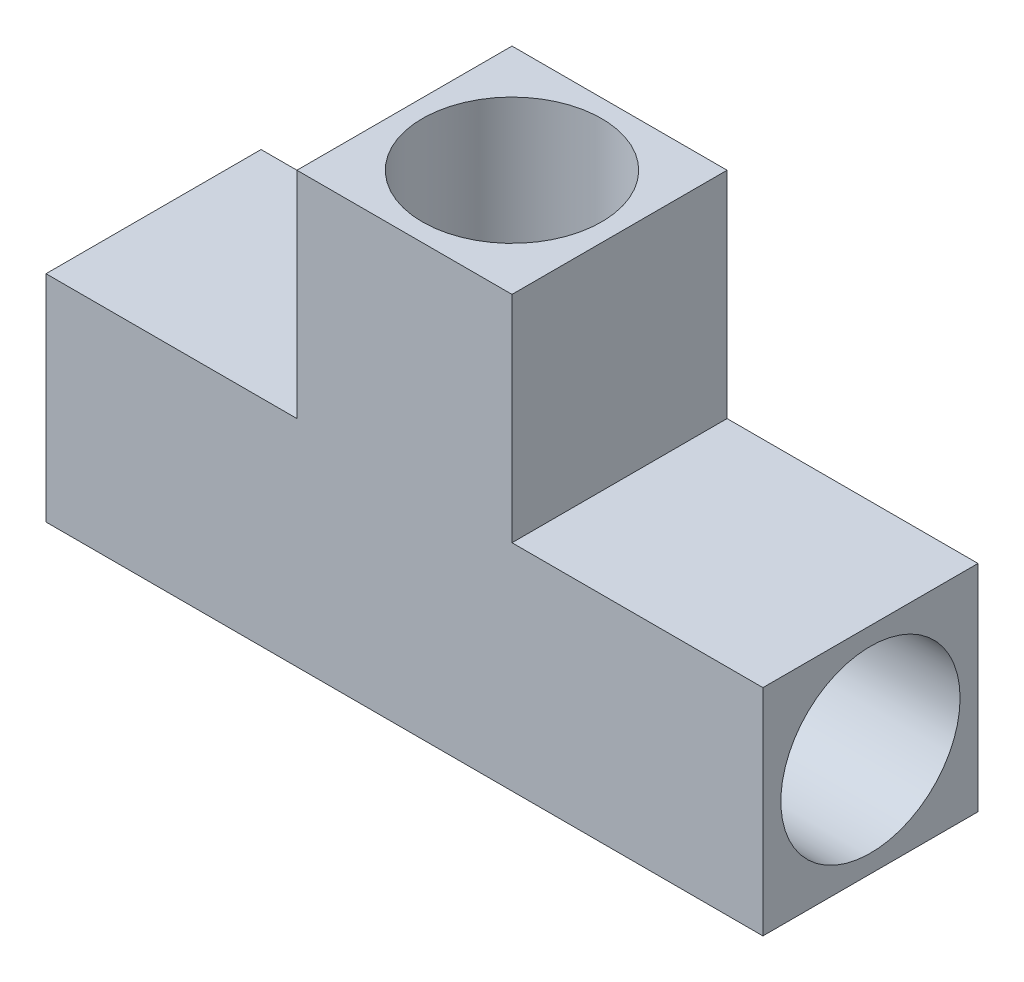
ISO-10303-21;
HEADER;
FILE_DESCRIPTION(('STEP AP214'),'2;1');
FILE_NAME('part.step','',(''),(''),'','','');
FILE_SCHEMA(('AUTOMOTIVE_DESIGN { 1 0 10303 214 1 1 1 1 }'));
ENDSEC;
DATA;
#1=APPLICATION_CONTEXT('core data for automotive mechanical design processes');
#2=APPLICATION_PROTOCOL_DEFINITION('international standard','automotive_design',2000,#1);
#3=PRODUCT_CONTEXT('',#1,'mechanical');
#4=PRODUCT('Part','Part','',(#3));
#5=PRODUCT_RELATED_PRODUCT_CATEGORY('part','',(#4));
#6=PRODUCT_DEFINITION_FORMATION('','',#4);
#7=PRODUCT_DEFINITION_CONTEXT('part definition',#1,'design');
#8=PRODUCT_DEFINITION('design','',#6,#7);
#9=PRODUCT_DEFINITION_SHAPE('','',#8);
#10=(LENGTH_UNIT() NAMED_UNIT(*) SI_UNIT(.MILLI.,.METRE.));
#11=(NAMED_UNIT(*) PLANE_ANGLE_UNIT() SI_UNIT($,.RADIAN.));
#12=(NAMED_UNIT(*) SI_UNIT($,.STERADIAN.) SOLID_ANGLE_UNIT());
#13=UNCERTAINTY_MEASURE_WITH_UNIT(LENGTH_MEASURE(1.E-05),#10,'distance_accuracy_value','');
#14=(GEOMETRIC_REPRESENTATION_CONTEXT(3) GLOBAL_UNCERTAINTY_ASSIGNED_CONTEXT((#13)) GLOBAL_UNIT_ASSIGNED_CONTEXT((#10,
#11,#12)) REPRESENTATION_CONTEXT('',''));
#15=CARTESIAN_POINT('',(0.,0.,0.));
#16=DIRECTION('',(0.,0.,1.));
#17=DIRECTION('',(1.,0.,0.));
#18=AXIS2_PLACEMENT_3D('',#15,#16,#17);
#19=CARTESIAN_POINT('',(50.,15.,15.));
#20=DIRECTION('',(-1.,0.,0.));
#21=DIRECTION('',(0.,0.,1.));
#22=AXIS2_PLACEMENT_3D('',#19,#20,#21);
#23=PLANE('',#22);
#24=CARTESIAN_POINT('',(50.,0.,0.));
#25=DIRECTION('',(1.,0.,0.));
#26=DIRECTION('',(0.,0.,-1.));
#27=AXIS2_PLACEMENT_3D('',#24,#25,#26);
#28=CIRCLE('',#27,12.5);
#29=CARTESIAN_POINT('',(50.,0.,-12.5));
#30=VERTEX_POINT('',#29);
#31=EDGE_CURVE('E192',#30,#30,#28,.T.);
#32=ORIENTED_EDGE('',*,*,#31,.F.);
#33=EDGE_LOOP('',(#32));
#34=FACE_BOUND('',#33,.T.);
#35=DIRECTION('',(0.,1.,0.));
#36=VECTOR('',#35,1.);
#37=CARTESIAN_POINT('',(50.,15.,-15.));
#38=LINE('',#37,#36);
#39=CARTESIAN_POINT('',(50.,-15.,-15.));
#40=VERTEX_POINT('',#39);
#41=CARTESIAN_POINT('',(50.,15.,-15.));
#42=VERTEX_POINT('',#41);
#43=EDGE_CURVE('E139',#40,#42,#38,.T.);
#44=ORIENTED_EDGE('',*,*,#43,.T.);
#45=DIRECTION('',(0.,0.,-1.));
#46=VECTOR('',#45,1.);
#47=CARTESIAN_POINT('',(50.,15.,15.));
#48=LINE('',#47,#46);
#49=CARTESIAN_POINT('',(50.,15.,15.));
#50=VERTEX_POINT('',#49);
#51=EDGE_CURVE('E168',#50,#42,#48,.T.);
#52=ORIENTED_EDGE('',*,*,#51,.F.);
#53=DIRECTION('',(0.,1.,0.));
#54=VECTOR('',#53,1.);
#55=CARTESIAN_POINT('',(50.,15.,15.));
#56=LINE('',#55,#54);
#57=CARTESIAN_POINT('',(50.,-15.,15.));
#58=VERTEX_POINT('',#57);
#59=EDGE_CURVE('E155',#58,#50,#56,.T.);
#60=ORIENTED_EDGE('',*,*,#59,.F.);
#61=DIRECTION('',(0.,0.,-1.));
#62=VECTOR('',#61,1.);
#63=CARTESIAN_POINT('',(50.,-15.,15.));
#64=LINE('',#63,#62);
#65=EDGE_CURVE('E135',#58,#40,#64,.T.);
#66=ORIENTED_EDGE('',*,*,#65,.T.);
#67=EDGE_LOOP('',(#44,#52,#60,#66));
#68=FACE_BOUND('',#67,.T.);
#69=ADVANCED_FACE('F35',(#34,#68),#23,.F.);
#70=CARTESIAN_POINT('',(15.,15.,15.));
#71=DIRECTION('',(0.,-1.,0.));
#72=DIRECTION('',(1.,0.,0.));
#73=AXIS2_PLACEMENT_3D('',#70,#71,#72);
#74=PLANE('',#73);
#75=DIRECTION('',(-1.,0.,0.));
#76=VECTOR('',#75,1.);
#77=CARTESIAN_POINT('',(15.,15.,-15.));
#78=LINE('',#77,#76);
#79=CARTESIAN_POINT('',(15.,15.,-15.));
#80=VERTEX_POINT('',#79);
#81=EDGE_CURVE('E142',#42,#80,#78,.T.);
#82=ORIENTED_EDGE('',*,*,#81,.T.);
#83=DIRECTION('',(0.,0.,-1.));
#84=VECTOR('',#83,1.);
#85=CARTESIAN_POINT('',(15.,15.,15.));
#86=LINE('',#85,#84);
#87=CARTESIAN_POINT('',(15.,15.,15.));
#88=VERTEX_POINT('',#87);
#89=EDGE_CURVE('E165',#88,#80,#86,.T.);
#90=ORIENTED_EDGE('',*,*,#89,.F.);
#91=DIRECTION('',(-1.,0.,0.));
#92=VECTOR('',#91,1.);
#93=CARTESIAN_POINT('',(15.,15.,15.));
#94=LINE('',#93,#92);
#95=EDGE_CURVE('E97',#50,#88,#94,.T.);
#96=ORIENTED_EDGE('',*,*,#95,.F.);
#97=ORIENTED_EDGE('',*,*,#51,.T.);
#98=EDGE_LOOP('',(#82,#90,#96,#97));
#99=FACE_BOUND('',#98,.T.);
#100=ADVANCED_FACE('F183',(#99),#74,.F.);
#101=CARTESIAN_POINT('',(15.,45.,15.));
#102=DIRECTION('',(-1.,0.,0.));
#103=DIRECTION('',(0.,0.,1.));
#104=AXIS2_PLACEMENT_3D('',#101,#102,#103);
#105=PLANE('',#104);
#106=DIRECTION('',(0.,1.,0.));
#107=VECTOR('',#106,1.);
#108=CARTESIAN_POINT('',(15.,45.,-15.));
#109=LINE('',#108,#107);
#110=CARTESIAN_POINT('',(15.,45.,-15.));
#111=VERTEX_POINT('',#110);
#112=EDGE_CURVE('E145',#80,#111,#109,.T.);
#113=ORIENTED_EDGE('',*,*,#112,.T.);
#114=DIRECTION('',(0.,0.,-1.));
#115=VECTOR('',#114,1.);
#116=CARTESIAN_POINT('',(15.,45.,15.));
#117=LINE('',#116,#115);
#118=CARTESIAN_POINT('',(15.,45.,15.));
#119=VERTEX_POINT('',#118);
#120=EDGE_CURVE('E162',#119,#111,#117,.T.);
#121=ORIENTED_EDGE('',*,*,#120,.F.);
#122=DIRECTION('',(0.,1.,0.));
#123=VECTOR('',#122,1.);
#124=CARTESIAN_POINT('',(15.,45.,15.));
#125=LINE('',#124,#123);
#126=EDGE_CURVE('E202',#88,#119,#125,.T.);
#127=ORIENTED_EDGE('',*,*,#126,.F.);
#128=ORIENTED_EDGE('',*,*,#89,.T.);
#129=EDGE_LOOP('',(#113,#121,#127,#128));
#130=FACE_BOUND('',#129,.T.);
#131=ADVANCED_FACE('F188',(#130),#105,.F.);
#132=CARTESIAN_POINT('',(-15.,45.,15.));
#133=DIRECTION('',(0.,-1.,0.));
#134=DIRECTION('',(0.,0.,-1.));
#135=AXIS2_PLACEMENT_3D('',#132,#133,#134);
#136=PLANE('',#135);
#137=CARTESIAN_POINT('',(0.,45.,0.));
#138=DIRECTION('',(0.,1.,0.));
#139=DIRECTION('',(0.,0.,1.));
#140=AXIS2_PLACEMENT_3D('',#137,#138,#139);
#141=CIRCLE('',#140,12.5);
#142=CARTESIAN_POINT('',(0.,45.,12.5));
#143=VERTEX_POINT('',#142);
#144=EDGE_CURVE('E211',#143,#143,#141,.T.);
#145=ORIENTED_EDGE('',*,*,#144,.F.);
#146=EDGE_LOOP('',(#145));
#147=FACE_BOUND('',#146,.T.);
#148=DIRECTION('',(-1.,0.,0.));
#149=VECTOR('',#148,1.);
#150=CARTESIAN_POINT('',(-15.,45.,-15.));
#151=LINE('',#150,#149);
#152=CARTESIAN_POINT('',(-15.,45.,-15.));
#153=VERTEX_POINT('',#152);
#154=EDGE_CURVE('E147',#111,#153,#151,.T.);
#155=ORIENTED_EDGE('',*,*,#154,.T.);
#156=DIRECTION('',(0.,0.,-1.));
#157=VECTOR('',#156,1.);
#158=CARTESIAN_POINT('',(-15.,45.,15.));
#159=LINE('',#158,#157);
#160=CARTESIAN_POINT('',(-15.,45.,15.));
#161=VERTEX_POINT('',#160);
#162=EDGE_CURVE('E159',#161,#153,#159,.T.);
#163=ORIENTED_EDGE('',*,*,#162,.F.);
#164=DIRECTION('',(-1.,0.,0.));
#165=VECTOR('',#164,1.);
#166=CARTESIAN_POINT('',(-15.,45.,15.));
#167=LINE('',#166,#165);
#168=EDGE_CURVE('E204',#119,#161,#167,.T.);
#169=ORIENTED_EDGE('',*,*,#168,.F.);
#170=ORIENTED_EDGE('',*,*,#120,.T.);
#171=EDGE_LOOP('',(#155,#163,#169,#170));
#172=FACE_BOUND('',#171,.T.);
#173=ADVANCED_FACE('F216',(#147,#172),#136,.F.);
#174=CARTESIAN_POINT('',(-15.,45.,15.));
#175=DIRECTION('',(1.,0.,0.));
#176=DIRECTION('',(0.,1.,0.));
#177=AXIS2_PLACEMENT_3D('',#174,#175,#176);
#178=PLANE('',#177);
#179=DIRECTION('',(0.,-1.,0.));
#180=VECTOR('',#179,1.);
#181=CARTESIAN_POINT('',(-15.,45.,-15.));
#182=LINE('',#181,#180);
#183=CARTESIAN_POINT('',(-15.,15.,-15.));
#184=VERTEX_POINT('',#183);
#185=EDGE_CURVE('E149',#153,#184,#182,.T.);
#186=ORIENTED_EDGE('',*,*,#185,.T.);
#187=DIRECTION('',(0.,0.,-1.));
#188=VECTOR('',#187,1.);
#189=CARTESIAN_POINT('',(-15.,15.,15.));
#190=LINE('',#189,#188);
#191=CARTESIAN_POINT('',(-15.,15.,15.));
#192=VERTEX_POINT('',#191);
#193=EDGE_CURVE('E130',#192,#184,#190,.T.);
#194=ORIENTED_EDGE('',*,*,#193,.F.);
#195=DIRECTION('',(0.,-1.,0.));
#196=VECTOR('',#195,1.);
#197=CARTESIAN_POINT('',(-15.,45.,15.));
#198=LINE('',#197,#196);
#199=EDGE_CURVE('E118',#161,#192,#198,.T.);
#200=ORIENTED_EDGE('',*,*,#199,.F.);
#201=ORIENTED_EDGE('',*,*,#162,.T.);
#202=EDGE_LOOP('',(#186,#194,#200,#201));
#203=FACE_BOUND('',#202,.T.);
#204=ADVANCED_FACE('F219',(#203),#178,.F.);
#205=CARTESIAN_POINT('',(-50.,15.,15.));
#206=DIRECTION('',(0.,-1.,0.));
#207=DIRECTION('',(1.,0.,0.));
#208=AXIS2_PLACEMENT_3D('',#205,#206,#207);
#209=PLANE('',#208);
#210=DIRECTION('',(-1.,0.,0.));
#211=VECTOR('',#210,1.);
#212=CARTESIAN_POINT('',(-50.,15.,-15.));
#213=LINE('',#212,#211);
#214=CARTESIAN_POINT('',(-50.,15.,-15.));
#215=VERTEX_POINT('',#214);
#216=EDGE_CURVE('E127',#184,#215,#213,.T.);
#217=ORIENTED_EDGE('',*,*,#216,.T.);
#218=DIRECTION('',(0.,0.,-1.));
#219=VECTOR('',#218,1.);
#220=CARTESIAN_POINT('',(-50.,15.,15.));
#221=LINE('',#220,#219);
#222=CARTESIAN_POINT('',(-50.,15.,15.));
#223=VERTEX_POINT('',#222);
#224=EDGE_CURVE('E124',#223,#215,#221,.T.);
#225=ORIENTED_EDGE('',*,*,#224,.F.);
#226=DIRECTION('',(-1.,0.,0.));
#227=VECTOR('',#226,1.);
#228=CARTESIAN_POINT('',(-50.,15.,15.));
#229=LINE('',#228,#227);
#230=EDGE_CURVE('E111',#192,#223,#229,.T.);
#231=ORIENTED_EDGE('',*,*,#230,.F.);
#232=ORIENTED_EDGE('',*,*,#193,.T.);
#233=EDGE_LOOP('',(#217,#225,#231,#232));
#234=FACE_BOUND('',#233,.T.);
#235=ADVANCED_FACE('F125',(#234),#209,.F.);
#236=CARTESIAN_POINT('',(-50.,15.,15.));
#237=DIRECTION('',(1.,0.,0.));
#238=DIRECTION('',(0.,0.,-1.));
#239=AXIS2_PLACEMENT_3D('',#236,#237,#238);
#240=PLANE('',#239);
#241=CARTESIAN_POINT('',(-50.,0.,0.));
#242=DIRECTION('',(1.,0.,0.));
#243=DIRECTION('',(0.,0.,-1.));
#244=AXIS2_PLACEMENT_3D('',#241,#242,#243);
#245=CIRCLE('',#244,12.5);
#246=CARTESIAN_POINT('',(-50.,0.,-12.5));
#247=VERTEX_POINT('',#246);
#248=EDGE_CURVE('E143',#247,#247,#245,.T.);
#249=ORIENTED_EDGE('',*,*,#248,.T.);
#250=EDGE_LOOP('',(#249));
#251=FACE_BOUND('',#250,.T.);
#252=DIRECTION('',(0.,-1.,0.));
#253=VECTOR('',#252,1.);
#254=CARTESIAN_POINT('',(-50.,15.,-15.));
#255=LINE('',#254,#253);
#256=CARTESIAN_POINT('',(-50.,-15.,-15.));
#257=VERTEX_POINT('',#256);
#258=EDGE_CURVE('E152',#215,#257,#255,.T.);
#259=ORIENTED_EDGE('',*,*,#258,.T.);
#260=DIRECTION('',(0.,0.,-1.));
#261=VECTOR('',#260,1.);
#262=CARTESIAN_POINT('',(-50.,-15.,15.));
#263=LINE('',#262,#261);
#264=CARTESIAN_POINT('',(-50.,-15.,15.));
#265=VERTEX_POINT('',#264);
#266=EDGE_CURVE('E131',#265,#257,#263,.T.);
#267=ORIENTED_EDGE('',*,*,#266,.F.);
#268=DIRECTION('',(0.,-1.,0.));
#269=VECTOR('',#268,1.);
#270=CARTESIAN_POINT('',(-50.,15.,15.));
#271=LINE('',#270,#269);
#272=EDGE_CURVE('E115',#223,#265,#271,.T.);
#273=ORIENTED_EDGE('',*,*,#272,.F.);
#274=ORIENTED_EDGE('',*,*,#224,.T.);
#275=EDGE_LOOP('',(#259,#267,#273,#274));
#276=FACE_BOUND('',#275,.T.);
#277=ADVANCED_FACE('F133',(#251,#276),#240,.F.);
#278=CARTESIAN_POINT('',(-50.,-15.,15.));
#279=DIRECTION('',(0.,1.,0.));
#280=DIRECTION('',(0.,0.,1.));
#281=AXIS2_PLACEMENT_3D('',#278,#279,#280);
#282=PLANE('',#281);
#283=DIRECTION('',(1.,0.,0.));
#284=VECTOR('',#283,1.);
#285=CARTESIAN_POINT('',(-50.,-15.,-15.));
#286=LINE('',#285,#284);
#287=EDGE_CURVE('E88',#257,#40,#286,.T.);
#288=ORIENTED_EDGE('',*,*,#287,.T.);
#289=ORIENTED_EDGE('',*,*,#65,.F.);
#290=DIRECTION('',(1.,0.,0.));
#291=VECTOR('',#290,1.);
#292=CARTESIAN_POINT('',(-50.,-15.,15.));
#293=LINE('',#292,#291);
#294=EDGE_CURVE('E55',#265,#58,#293,.T.);
#295=ORIENTED_EDGE('',*,*,#294,.F.);
#296=ORIENTED_EDGE('',*,*,#266,.T.);
#297=EDGE_LOOP('',(#288,#289,#295,#296));
#298=FACE_BOUND('',#297,.T.);
#299=ADVANCED_FACE('F224',(#298),#282,.F.);
#300=CARTESIAN_POINT('',(0.,0.,15.));
#301=DIRECTION('',(0.,0.,1.));
#302=DIRECTION('',(1.,0.,0.));
#303=AXIS2_PLACEMENT_3D('',#300,#301,#302);
#304=PLANE('',#303);
#305=ORIENTED_EDGE('',*,*,#59,.T.);
#306=ORIENTED_EDGE('',*,*,#95,.T.);
#307=ORIENTED_EDGE('',*,*,#126,.T.);
#308=ORIENTED_EDGE('',*,*,#168,.T.);
#309=ORIENTED_EDGE('',*,*,#199,.T.);
#310=ORIENTED_EDGE('',*,*,#230,.T.);
#311=ORIENTED_EDGE('',*,*,#272,.T.);
#312=ORIENTED_EDGE('',*,*,#294,.T.);
#313=EDGE_LOOP('',(#305,#306,#307,#308,#309,#310,#311,#312));
#314=FACE_BOUND('',#313,.T.);
#315=ADVANCED_FACE('F113',(#314),#304,.T.);
#316=CARTESIAN_POINT('',(0.,0.,-15.));
#317=DIRECTION('',(0.,0.,1.));
#318=DIRECTION('',(1.,0.,0.));
#319=AXIS2_PLACEMENT_3D('',#316,#317,#318);
#320=PLANE('',#319);
#321=ORIENTED_EDGE('',*,*,#43,.F.);
#322=ORIENTED_EDGE('',*,*,#287,.F.);
#323=ORIENTED_EDGE('',*,*,#258,.F.);
#324=ORIENTED_EDGE('',*,*,#216,.F.);
#325=ORIENTED_EDGE('',*,*,#185,.F.);
#326=ORIENTED_EDGE('',*,*,#154,.F.);
#327=ORIENTED_EDGE('',*,*,#112,.F.);
#328=ORIENTED_EDGE('',*,*,#81,.F.);
#329=EDGE_LOOP('',(#321,#322,#323,#324,#325,#326,#327,#328));
#330=FACE_BOUND('',#329,.T.);
#331=ADVANCED_FACE('F179',(#330),#320,.F.);
#332=CARTESIAN_POINT('',(-50.,0.,0.));
#333=DIRECTION('',(1.,0.,0.));
#334=DIRECTION('',(0.,0.,-1.));
#335=AXIS2_PLACEMENT_3D('',#332,#333,#334);
#336=CYLINDRICAL_SURFACE('',#335,12.5);
#337=CARTESIAN_POINT('',(0.,0.,0.));
#338=DIRECTION('',(0.707106781186547,-0.707106781186547,0.));
#339=DIRECTION('',(0.707106781186547,0.707106781186547,0.));
#340=AXIS2_PLACEMENT_3D('',#337,#338,#339);
#341=ELLIPSE('',#340,17.6776695296637,12.5);
#342=CARTESIAN_POINT('',(0.,0.,12.5));
#343=VERTEX_POINT('',#342);
#344=CARTESIAN_POINT('',(0.,0.,-12.5));
#345=VERTEX_POINT('',#344);
#346=EDGE_CURVE('E42',#343,#345,#341,.F.);
#347=ORIENTED_EDGE('',*,*,#346,.T.);
#348=CARTESIAN_POINT('',(0.,0.,0.));
#349=DIRECTION('',(0.707106781186547,0.707106781186547,0.));
#350=DIRECTION('',(0.707106781186547,-0.707106781186547,0.));
#351=AXIS2_PLACEMENT_3D('',#348,#349,#350);
#352=ELLIPSE('',#351,17.6776695296637,12.5);
#353=EDGE_CURVE('E11',#345,#343,#352,.T.);
#354=ORIENTED_EDGE('',*,*,#353,.T.);
#355=EDGE_LOOP('',(#347,#354));
#356=FACE_BOUND('',#355,.T.);
#357=ORIENTED_EDGE('',*,*,#248,.F.);
#358=EDGE_LOOP('',(#357));
#359=FACE_BOUND('',#358,.T.);
#360=ORIENTED_EDGE('',*,*,#31,.T.);
#361=EDGE_LOOP('',(#360));
#362=FACE_BOUND('',#361,.T.);
#363=ADVANCED_FACE('F170',(#356,#359,#362),#336,.F.);
#364=CARTESIAN_POINT('',(0.,0.,0.));
#365=DIRECTION('',(0.,1.,0.));
#366=DIRECTION('',(0.,0.,1.));
#367=AXIS2_PLACEMENT_3D('',#364,#365,#366);
#368=CYLINDRICAL_SURFACE('',#367,12.5);
#369=ORIENTED_EDGE('',*,*,#144,.T.);
#370=EDGE_LOOP('',(#369));
#371=FACE_BOUND('',#370,.T.);
#372=ORIENTED_EDGE('',*,*,#346,.F.);
#373=ORIENTED_EDGE('',*,*,#353,.F.);
#374=EDGE_LOOP('',(#372,#373));
#375=FACE_BOUND('',#374,.T.);
#376=ADVANCED_FACE('F172',(#371,#375),#368,.F.);
#377=CLOSED_SHELL('',(#69,#100,#131,#173,#204,#235,#277,#299,#315,#331,#363,#376));
#378=MANIFOLD_SOLID_BREP('B2',#377);
#379=ADVANCED_BREP_SHAPE_REPRESENTATION('',(#18,#378),#14);
#380=SHAPE_DEFINITION_REPRESENTATION(#9,#379);
ENDSEC;
END-ISO-10303-21;
